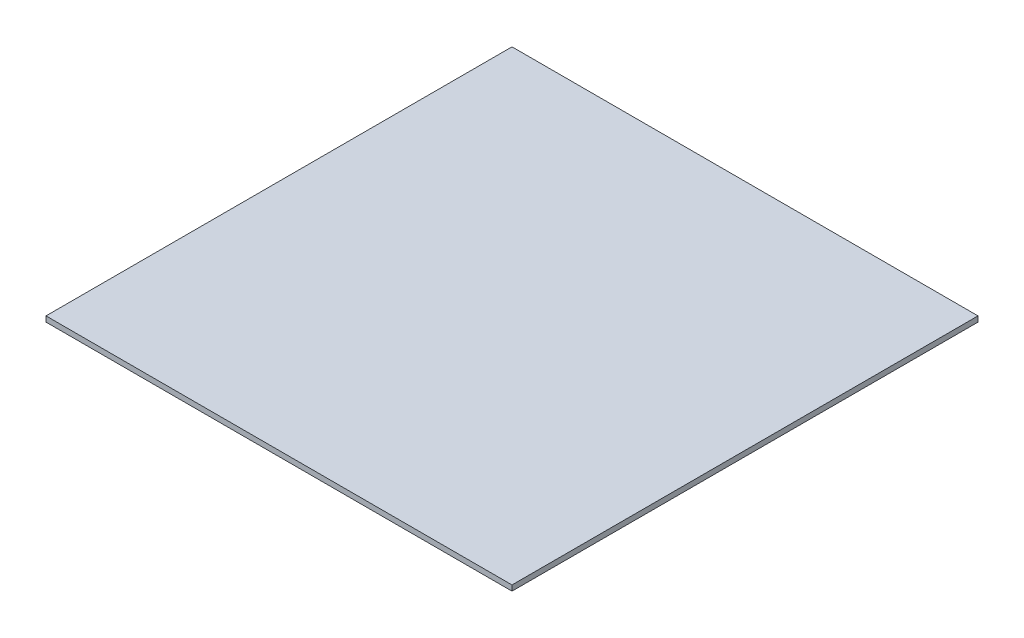
ISO-10303-21;
HEADER;
FILE_DESCRIPTION(('STEP AP214'),'2;1');
FILE_NAME('part.step','',(''),(''),'','','');
FILE_SCHEMA(('AUTOMOTIVE_DESIGN { 1 0 10303 214 1 1 1 1 }'));
ENDSEC;
DATA;
#1=APPLICATION_CONTEXT('core data for automotive mechanical design processes');
#2=APPLICATION_PROTOCOL_DEFINITION('international standard','automotive_design',2000,#1);
#3=PRODUCT_CONTEXT('',#1,'mechanical');
#4=PRODUCT('Part','Part','',(#3));
#5=PRODUCT_RELATED_PRODUCT_CATEGORY('part','',(#4));
#6=PRODUCT_DEFINITION_FORMATION('','',#4);
#7=PRODUCT_DEFINITION_CONTEXT('part definition',#1,'design');
#8=PRODUCT_DEFINITION('design','',#6,#7);
#9=PRODUCT_DEFINITION_SHAPE('','',#8);
#10=(LENGTH_UNIT() NAMED_UNIT(*) SI_UNIT(.MILLI.,.METRE.));
#11=(NAMED_UNIT(*) PLANE_ANGLE_UNIT() SI_UNIT($,.RADIAN.));
#12=(NAMED_UNIT(*) SI_UNIT($,.STERADIAN.) SOLID_ANGLE_UNIT());
#13=UNCERTAINTY_MEASURE_WITH_UNIT(LENGTH_MEASURE(1.E-05),#10,'distance_accuracy_value','');
#14=(GEOMETRIC_REPRESENTATION_CONTEXT(3) GLOBAL_UNCERTAINTY_ASSIGNED_CONTEXT((#13)) GLOBAL_UNIT_ASSIGNED_CONTEXT((#10,
#11,#12)) REPRESENTATION_CONTEXT('',''));
#15=CARTESIAN_POINT('',(0.,0.,0.));
#16=DIRECTION('',(0.,0.,1.));
#17=DIRECTION('',(1.,0.,0.));
#18=AXIS2_PLACEMENT_3D('',#15,#16,#17);
#19=CARTESIAN_POINT('',(215.,5.,215.));
#20=DIRECTION('',(-1.,0.,0.));
#21=DIRECTION('',(0.,0.,1.));
#22=AXIS2_PLACEMENT_3D('',#19,#20,#21);
#23=PLANE('',#22);
#24=DIRECTION('',(0.,0.,-1.));
#25=VECTOR('',#24,1.);
#26=CARTESIAN_POINT('',(215.,0.,215.));
#27=LINE('',#26,#25);
#28=CARTESIAN_POINT('',(215.,0.,215.));
#29=VERTEX_POINT('',#28);
#30=CARTESIAN_POINT('',(215.,0.,-215.));
#31=VERTEX_POINT('',#30);
#32=EDGE_CURVE('E96',#29,#31,#27,.T.);
#33=ORIENTED_EDGE('',*,*,#32,.T.);
#34=DIRECTION('',(0.,-1.,0.));
#35=VECTOR('',#34,1.);
#36=CARTESIAN_POINT('',(215.,5.,-215.));
#37=LINE('',#36,#35);
#38=CARTESIAN_POINT('',(215.,5.,-215.));
#39=VERTEX_POINT('',#38);
#40=EDGE_CURVE('E11',#39,#31,#37,.T.);
#41=ORIENTED_EDGE('',*,*,#40,.F.);
#42=DIRECTION('',(0.,0.,-1.));
#43=VECTOR('',#42,1.);
#44=CARTESIAN_POINT('',(215.,5.,215.));
#45=LINE('',#44,#43);
#46=CARTESIAN_POINT('',(215.,5.,215.));
#47=VERTEX_POINT('',#46);
#48=EDGE_CURVE('E84',#47,#39,#45,.T.);
#49=ORIENTED_EDGE('',*,*,#48,.F.);
#50=DIRECTION('',(0.,-1.,0.));
#51=VECTOR('',#50,1.);
#52=CARTESIAN_POINT('',(215.,5.,215.));
#53=LINE('',#52,#51);
#54=EDGE_CURVE('E92',#47,#29,#53,.T.);
#55=ORIENTED_EDGE('',*,*,#54,.T.);
#56=EDGE_LOOP('',(#33,#41,#49,#55));
#57=FACE_BOUND('',#56,.T.);
#58=ADVANCED_FACE('F33',(#57),#23,.F.);
#59=CARTESIAN_POINT('',(-215.,5.,-215.));
#60=DIRECTION('',(0.,0.,1.));
#61=DIRECTION('',(1.,0.,0.));
#62=AXIS2_PLACEMENT_3D('',#59,#60,#61);
#63=PLANE('',#62);
#64=DIRECTION('',(-1.,0.,0.));
#65=VECTOR('',#64,1.);
#66=CARTESIAN_POINT('',(-215.,0.,-215.));
#67=LINE('',#66,#65);
#68=CARTESIAN_POINT('',(-215.,0.,-215.));
#69=VERTEX_POINT('',#68);
#70=EDGE_CURVE('E88',#31,#69,#67,.T.);
#71=ORIENTED_EDGE('',*,*,#70,.T.);
#72=DIRECTION('',(0.,-1.,0.));
#73=VECTOR('',#72,1.);
#74=CARTESIAN_POINT('',(-215.,5.,-215.));
#75=LINE('',#74,#73);
#76=CARTESIAN_POINT('',(-215.,5.,-215.));
#77=VERTEX_POINT('',#76);
#78=EDGE_CURVE('E41',#77,#69,#75,.T.);
#79=ORIENTED_EDGE('',*,*,#78,.F.);
#80=DIRECTION('',(-1.,0.,0.));
#81=VECTOR('',#80,1.);
#82=CARTESIAN_POINT('',(-215.,5.,-215.));
#83=LINE('',#82,#81);
#84=EDGE_CURVE('E79',#39,#77,#83,.T.);
#85=ORIENTED_EDGE('',*,*,#84,.F.);
#86=ORIENTED_EDGE('',*,*,#40,.T.);
#87=EDGE_LOOP('',(#71,#79,#85,#86));
#88=FACE_BOUND('',#87,.T.);
#89=ADVANCED_FACE('F87',(#88),#63,.F.);
#90=CARTESIAN_POINT('',(-215.,5.,215.));
#91=DIRECTION('',(1.,0.,0.));
#92=DIRECTION('',(0.,0.,-1.));
#93=AXIS2_PLACEMENT_3D('',#90,#91,#92);
#94=PLANE('',#93);
#95=DIRECTION('',(0.,0.,1.));
#96=VECTOR('',#95,1.);
#97=CARTESIAN_POINT('',(-215.,0.,215.));
#98=LINE('',#97,#96);
#99=CARTESIAN_POINT('',(-215.,0.,215.));
#100=VERTEX_POINT('',#99);
#101=EDGE_CURVE('E66',#69,#100,#98,.T.);
#102=ORIENTED_EDGE('',*,*,#101,.T.);
#103=DIRECTION('',(0.,-1.,0.));
#104=VECTOR('',#103,1.);
#105=CARTESIAN_POINT('',(-215.,5.,215.));
#106=LINE('',#105,#104);
#107=CARTESIAN_POINT('',(-215.,5.,215.));
#108=VERTEX_POINT('',#107);
#109=EDGE_CURVE('E89',#108,#100,#106,.T.);
#110=ORIENTED_EDGE('',*,*,#109,.F.);
#111=DIRECTION('',(0.,0.,1.));
#112=VECTOR('',#111,1.);
#113=CARTESIAN_POINT('',(-215.,5.,215.));
#114=LINE('',#113,#112);
#115=EDGE_CURVE('E82',#77,#108,#114,.T.);
#116=ORIENTED_EDGE('',*,*,#115,.F.);
#117=ORIENTED_EDGE('',*,*,#78,.T.);
#118=EDGE_LOOP('',(#102,#110,#116,#117));
#119=FACE_BOUND('',#118,.T.);
#120=ADVANCED_FACE('F90',(#119),#94,.F.);
#121=CARTESIAN_POINT('',(-215.,5.,215.));
#122=DIRECTION('',(0.,0.,-1.));
#123=DIRECTION('',(-1.,0.,0.));
#124=AXIS2_PLACEMENT_3D('',#121,#122,#123);
#125=PLANE('',#124);
#126=DIRECTION('',(1.,0.,0.));
#127=VECTOR('',#126,1.);
#128=CARTESIAN_POINT('',(-215.,0.,215.));
#129=LINE('',#128,#127);
#130=EDGE_CURVE('E72',#100,#29,#129,.T.);
#131=ORIENTED_EDGE('',*,*,#130,.T.);
#132=ORIENTED_EDGE('',*,*,#54,.F.);
#133=DIRECTION('',(1.,0.,0.));
#134=VECTOR('',#133,1.);
#135=CARTESIAN_POINT('',(-215.,5.,215.));
#136=LINE('',#135,#134);
#137=EDGE_CURVE('E49',#108,#47,#136,.T.);
#138=ORIENTED_EDGE('',*,*,#137,.F.);
#139=ORIENTED_EDGE('',*,*,#109,.T.);
#140=EDGE_LOOP('',(#131,#132,#138,#139));
#141=FACE_BOUND('',#140,.T.);
#142=ADVANCED_FACE('F103',(#141),#125,.F.);
#143=CARTESIAN_POINT('',(0.,5.,0.));
#144=DIRECTION('',(0.,-1.,0.));
#145=DIRECTION('',(0.,0.,-1.));
#146=AXIS2_PLACEMENT_3D('',#143,#144,#145);
#147=PLANE('',#146);
#148=ORIENTED_EDGE('',*,*,#48,.T.);
#149=ORIENTED_EDGE('',*,*,#84,.T.);
#150=ORIENTED_EDGE('',*,*,#115,.T.);
#151=ORIENTED_EDGE('',*,*,#137,.T.);
#152=EDGE_LOOP('',(#148,#149,#150,#151));
#153=FACE_BOUND('',#152,.T.);
#154=ADVANCED_FACE('F80',(#153),#147,.F.);
#155=CARTESIAN_POINT('',(0.,0.,0.));
#156=DIRECTION('',(0.,-1.,0.));
#157=DIRECTION('',(0.,0.,-1.));
#158=AXIS2_PLACEMENT_3D('',#155,#156,#157);
#159=PLANE('',#158);
#160=ORIENTED_EDGE('',*,*,#32,.F.);
#161=ORIENTED_EDGE('',*,*,#130,.F.);
#162=ORIENTED_EDGE('',*,*,#101,.F.);
#163=ORIENTED_EDGE('',*,*,#70,.F.);
#164=EDGE_LOOP('',(#160,#161,#162,#163));
#165=FACE_BOUND('',#164,.T.);
#166=ADVANCED_FACE('F106',(#165),#159,.T.);
#167=CLOSED_SHELL('',(#58,#89,#120,#142,#154,#166));
#168=MANIFOLD_SOLID_BREP('B2',#167);
#169=ADVANCED_BREP_SHAPE_REPRESENTATION('',(#18,#168),#14);
#170=SHAPE_DEFINITION_REPRESENTATION(#9,#169);
ENDSEC;
END-ISO-10303-21;
